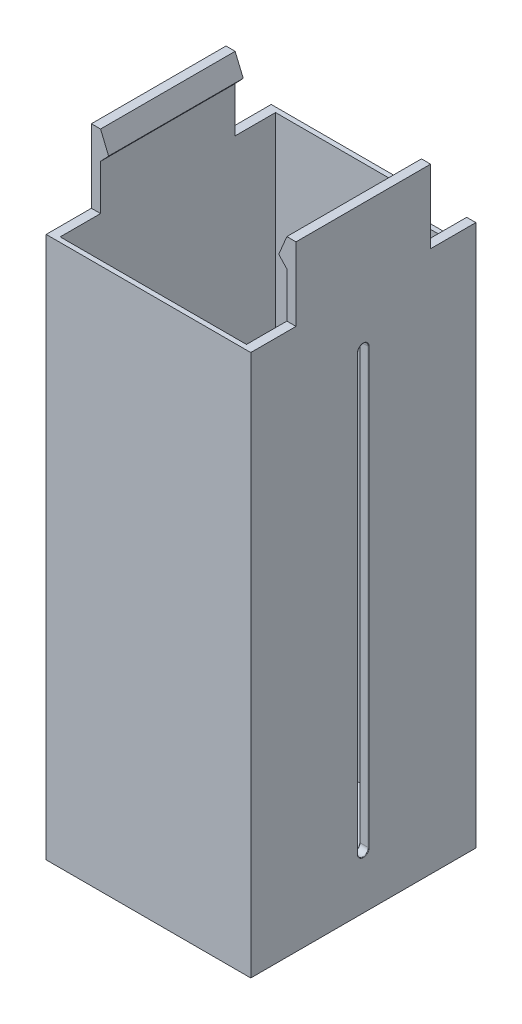
ISO-10303-21;
HEADER;
FILE_DESCRIPTION(('STEP AP214'),'2;1');
FILE_NAME('part.step','',(''),(''),'','','');
FILE_SCHEMA(('AUTOMOTIVE_DESIGN { 1 0 10303 214 1 1 1 1 }'));
ENDSEC;
DATA;
#1=APPLICATION_CONTEXT('core data for automotive mechanical design processes');
#2=APPLICATION_PROTOCOL_DEFINITION('international standard','automotive_design',2000,#1);
#3=PRODUCT_CONTEXT('',#1,'mechanical');
#4=PRODUCT('Part','Part','',(#3));
#5=PRODUCT_RELATED_PRODUCT_CATEGORY('part','',(#4));
#6=PRODUCT_DEFINITION_FORMATION('','',#4);
#7=PRODUCT_DEFINITION_CONTEXT('part definition',#1,'design');
#8=PRODUCT_DEFINITION('design','',#6,#7);
#9=PRODUCT_DEFINITION_SHAPE('','',#8);
#10=(LENGTH_UNIT() NAMED_UNIT(*) SI_UNIT(.MILLI.,.METRE.));
#11=(NAMED_UNIT(*) PLANE_ANGLE_UNIT() SI_UNIT($,.RADIAN.));
#12=(NAMED_UNIT(*) SI_UNIT($,.STERADIAN.) SOLID_ANGLE_UNIT());
#13=UNCERTAINTY_MEASURE_WITH_UNIT(LENGTH_MEASURE(1.E-05),#10,'distance_accuracy_value','');
#14=(GEOMETRIC_REPRESENTATION_CONTEXT(3) GLOBAL_UNCERTAINTY_ASSIGNED_CONTEXT((#13)) GLOBAL_UNIT_ASSIGNED_CONTEXT((#10,
#11,#12)) REPRESENTATION_CONTEXT('',''));
#15=CARTESIAN_POINT('',(0.,0.,0.));
#16=DIRECTION('',(0.,0.,1.));
#17=DIRECTION('',(1.,0.,0.));
#18=AXIS2_PLACEMENT_3D('',#15,#16,#17);
#19=CARTESIAN_POINT('',(0.,100.,0.));
#20=DIRECTION('',(0.,1.,0.));
#21=DIRECTION('',(0.,0.,1.));
#22=AXIS2_PLACEMENT_3D('',#19,#20,#21);
#23=PLANE('',#22);
#24=DIRECTION('',(-1.,0.,0.));
#25=VECTOR('',#24,1.);
#26=CARTESIAN_POINT('',(-19.,100.,-20.9));
#27=LINE('',#26,#25);
#28=CARTESIAN_POINT('',(19.,100.,-20.9));
#29=VERTEX_POINT('',#28);
#30=CARTESIAN_POINT('',(17.3,100.,-20.9));
#31=VERTEX_POINT('',#30);
#32=EDGE_CURVE('E403',#29,#31,#27,.T.);
#33=ORIENTED_EDGE('',*,*,#32,.T.);
#34=DIRECTION('',(0.,0.,-1.));
#35=VECTOR('',#34,1.);
#36=CARTESIAN_POINT('',(17.3,100.,-20.));
#37=LINE('',#36,#35);
#38=CARTESIAN_POINT('',(17.3,100.,-12.5));
#39=VERTEX_POINT('',#38);
#40=EDGE_CURVE('E258',#39,#31,#37,.T.);
#41=ORIENTED_EDGE('',*,*,#40,.F.);
#42=DIRECTION('',(-1.,0.,0.));
#43=VECTOR('',#42,1.);
#44=CARTESIAN_POINT('',(17.3,100.,-12.5));
#45=LINE('',#44,#43);
#46=CARTESIAN_POINT('',(19.,100.,-12.5));
#47=VERTEX_POINT('',#46);
#48=EDGE_CURVE('E320',#47,#39,#45,.T.);
#49=ORIENTED_EDGE('',*,*,#48,.F.);
#50=DIRECTION('',(0.,0.,-1.));
#51=VECTOR('',#50,1.);
#52=CARTESIAN_POINT('',(19.,100.,-20.9));
#53=LINE('',#52,#51);
#54=EDGE_CURVE('E398',#47,#29,#53,.T.);
#55=ORIENTED_EDGE('',*,*,#54,.T.);
#56=EDGE_LOOP('',(#33,#41,#49,#55));
#57=FACE_BOUND('',#56,.T.);
#58=ADVANCED_FACE('F35',(#57),#23,.T.);
#59=CARTESIAN_POINT('',(19.,100.,20.9));
#60=VERTEX_POINT('',#59);
#61=CARTESIAN_POINT('',(19.,100.,12.5));
#62=VERTEX_POINT('',#61);
#63=EDGE_CURVE('E399',#60,#62,#53,.T.);
#64=ORIENTED_EDGE('',*,*,#63,.T.);
#65=DIRECTION('',(1.,0.,0.));
#66=VECTOR('',#65,1.);
#67=CARTESIAN_POINT('',(17.3,100.,12.5));
#68=LINE('',#67,#66);
#69=CARTESIAN_POINT('',(17.3,100.,12.5));
#70=VERTEX_POINT('',#69);
#71=EDGE_CURVE('E306',#70,#62,#68,.T.);
#72=ORIENTED_EDGE('',*,*,#71,.F.);
#73=CARTESIAN_POINT('',(17.3,100.,20.));
#74=VERTEX_POINT('',#73);
#75=EDGE_CURVE('E373',#74,#70,#37,.T.);
#76=ORIENTED_EDGE('',*,*,#75,.F.);
#77=DIRECTION('',(1.,0.,0.));
#78=VECTOR('',#77,1.);
#79=CARTESIAN_POINT('',(17.3,100.,20.));
#80=LINE('',#79,#78);
#81=CARTESIAN_POINT('',(-17.3,100.,20.));
#82=VERTEX_POINT('',#81);
#83=EDGE_CURVE('E370',#82,#74,#80,.T.);
#84=ORIENTED_EDGE('',*,*,#83,.F.);
#85=DIRECTION('',(0.,0.,1.));
#86=VECTOR('',#85,1.);
#87=CARTESIAN_POINT('',(-17.3,100.,-20.));
#88=LINE('',#87,#86);
#89=CARTESIAN_POINT('',(-17.3,100.,12.5));
#90=VERTEX_POINT('',#89);
#91=EDGE_CURVE('E371',#90,#82,#88,.T.);
#92=ORIENTED_EDGE('',*,*,#91,.F.);
#93=DIRECTION('',(1.,0.,0.));
#94=VECTOR('',#93,1.);
#95=CARTESIAN_POINT('',(-17.3,100.,12.5));
#96=LINE('',#95,#94);
#97=CARTESIAN_POINT('',(-19.,100.,12.5));
#98=VERTEX_POINT('',#97);
#99=EDGE_CURVE('E339',#98,#90,#96,.T.);
#100=ORIENTED_EDGE('',*,*,#99,.F.);
#101=DIRECTION('',(0.,0.,1.));
#102=VECTOR('',#101,1.);
#103=CARTESIAN_POINT('',(-19.,100.,-20.9));
#104=LINE('',#103,#102);
#105=CARTESIAN_POINT('',(-19.,100.,20.9));
#106=VERTEX_POINT('',#105);
#107=EDGE_CURVE('E405',#98,#106,#104,.T.);
#108=ORIENTED_EDGE('',*,*,#107,.T.);
#109=DIRECTION('',(1.,0.,0.));
#110=VECTOR('',#109,1.);
#111=CARTESIAN_POINT('',(-19.,100.,20.9));
#112=LINE('',#111,#110);
#113=EDGE_CURVE('E408',#106,#60,#112,.T.);
#114=ORIENTED_EDGE('',*,*,#113,.T.);
#115=EDGE_LOOP('',(#64,#72,#76,#84,#92,#100,#108,#114));
#116=FACE_BOUND('',#115,.T.);
#117=ADVANCED_FACE('F543',(#116),#23,.T.);
#118=DIRECTION('',(0.,0.,-1.));
#119=VECTOR('',#118,1.);
#120=CARTESIAN_POINT('',(3.99999999999999,100.,-10.9));
#121=LINE('',#120,#119);
#122=CARTESIAN_POINT('',(3.99999999999999,100.,-20.));
#123=VERTEX_POINT('',#122);
#124=CARTESIAN_POINT('',(3.99999999999999,100.,-20.9));
#125=VERTEX_POINT('',#124);
#126=EDGE_CURVE('E270',#123,#125,#121,.T.);
#127=ORIENTED_EDGE('',*,*,#126,.T.);
#128=CARTESIAN_POINT('',(-19.,100.,-20.9));
#129=VERTEX_POINT('',#128);
#130=EDGE_CURVE('E402',#125,#129,#27,.T.);
#131=ORIENTED_EDGE('',*,*,#130,.T.);
#132=CARTESIAN_POINT('',(-19.,100.,-12.5));
#133=VERTEX_POINT('',#132);
#134=EDGE_CURVE('E406',#129,#133,#104,.T.);
#135=ORIENTED_EDGE('',*,*,#134,.T.);
#136=DIRECTION('',(-1.,0.,0.));
#137=VECTOR('',#136,1.);
#138=CARTESIAN_POINT('',(-17.3,100.,-12.5));
#139=LINE('',#138,#137);
#140=CARTESIAN_POINT('',(-17.3,100.,-12.5));
#141=VERTEX_POINT('',#140);
#142=EDGE_CURVE('E344',#141,#133,#139,.T.);
#143=ORIENTED_EDGE('',*,*,#142,.F.);
#144=CARTESIAN_POINT('',(-17.3,100.,-20.));
#145=VERTEX_POINT('',#144);
#146=EDGE_CURVE('E367',#145,#141,#88,.T.);
#147=ORIENTED_EDGE('',*,*,#146,.F.);
#148=DIRECTION('',(-1.,0.,0.));
#149=VECTOR('',#148,1.);
#150=CARTESIAN_POINT('',(17.3,100.,-20.));
#151=LINE('',#150,#149);
#152=EDGE_CURVE('E376',#123,#145,#151,.T.);
#153=ORIENTED_EDGE('',*,*,#152,.F.);
#154=EDGE_LOOP('',(#127,#131,#135,#143,#147,#153));
#155=FACE_BOUND('',#154,.T.);
#156=ADVANCED_FACE('F546',(#155),#23,.T.);
#157=CARTESIAN_POINT('',(19.,100.,-20.9));
#158=DIRECTION('',(-1.,0.,0.));
#159=DIRECTION('',(0.,0.,1.));
#160=AXIS2_PLACEMENT_3D('',#157,#158,#159);
#161=PLANE('',#160);
#162=DIRECTION('',(0.,-1.,0.));
#163=VECTOR('',#162,1.);
#164=CARTESIAN_POINT('',(19.,100.,1.1));
#165=LINE('',#164,#163);
#166=CARTESIAN_POINT('',(19.,9.4,1.1));
#167=VERTEX_POINT('',#166);
#168=CARTESIAN_POINT('',(19.,90.,1.1));
#169=VERTEX_POINT('',#168);
#170=EDGE_CURVE('E445',#167,#169,#165,.F.);
#171=ORIENTED_EDGE('',*,*,#170,.T.);
#172=CARTESIAN_POINT('',(19.,90.,0.));
#173=DIRECTION('',(-1.,0.,0.));
#174=DIRECTION('',(0.,0.,1.));
#175=AXIS2_PLACEMENT_3D('',#172,#173,#174);
#176=CIRCLE('',#175,1.1);
#177=CARTESIAN_POINT('',(19.,90.,-1.1));
#178=VERTEX_POINT('',#177);
#179=EDGE_CURVE('E450',#169,#178,#176,.T.);
#180=ORIENTED_EDGE('',*,*,#179,.T.);
#181=DIRECTION('',(0.,1.,0.));
#182=VECTOR('',#181,1.);
#183=CARTESIAN_POINT('',(19.,100.,-1.1));
#184=LINE('',#183,#182);
#185=CARTESIAN_POINT('',(19.,9.4,-1.1));
#186=VERTEX_POINT('',#185);
#187=EDGE_CURVE('E59',#178,#186,#184,.F.);
#188=ORIENTED_EDGE('',*,*,#187,.T.);
#189=CARTESIAN_POINT('',(19.,9.4,0.));
#190=DIRECTION('',(-1.,0.,0.));
#191=DIRECTION('',(0.,0.,1.));
#192=AXIS2_PLACEMENT_3D('',#189,#190,#191);
#193=CIRCLE('',#192,1.1);
#194=EDGE_CURVE('E447',#186,#167,#193,.T.);
#195=ORIENTED_EDGE('',*,*,#194,.T.);
#196=EDGE_LOOP('',(#171,#180,#188,#195));
#197=FACE_BOUND('',#196,.T.);
#198=DIRECTION('',(0.,-1.,0.));
#199=VECTOR('',#198,1.);
#200=CARTESIAN_POINT('',(19.,100.,20.9));
#201=LINE('',#200,#199);
#202=CARTESIAN_POINT('',(19.,-0.6,20.9));
#203=VERTEX_POINT('',#202);
#204=EDGE_CURVE('E410',#60,#203,#201,.T.);
#205=ORIENTED_EDGE('',*,*,#204,.T.);
#206=DIRECTION('',(0.,0.,1.));
#207=VECTOR('',#206,1.);
#208=CARTESIAN_POINT('',(19.,-0.6,20.9));
#209=LINE('',#208,#207);
#210=CARTESIAN_POINT('',(19.,-0.6,-20.9));
#211=VERTEX_POINT('',#210);
#212=EDGE_CURVE('E273',#211,#203,#209,.T.);
#213=ORIENTED_EDGE('',*,*,#212,.F.);
#214=DIRECTION('',(0.,-1.,0.));
#215=VECTOR('',#214,1.);
#216=CARTESIAN_POINT('',(19.,100.,-20.9));
#217=LINE('',#216,#215);
#218=EDGE_CURVE('E416',#29,#211,#217,.T.);
#219=ORIENTED_EDGE('',*,*,#218,.F.);
#220=ORIENTED_EDGE('',*,*,#54,.F.);
#221=DIRECTION('',(0.,-1.,0.));
#222=VECTOR('',#221,1.);
#223=CARTESIAN_POINT('',(19.,113.6,-12.5));
#224=LINE('',#223,#222);
#225=CARTESIAN_POINT('',(19.,113.6,-12.5));
#226=VERTEX_POINT('',#225);
#227=EDGE_CURVE('E332',#226,#47,#224,.T.);
#228=ORIENTED_EDGE('',*,*,#227,.F.);
#229=DIRECTION('',(0.,0.,-1.));
#230=VECTOR('',#229,1.);
#231=CARTESIAN_POINT('',(19.,113.6,12.5));
#232=LINE('',#231,#230);
#233=CARTESIAN_POINT('',(19.,113.6,12.5));
#234=VERTEX_POINT('',#233);
#235=EDGE_CURVE('E322',#234,#226,#232,.T.);
#236=ORIENTED_EDGE('',*,*,#235,.F.);
#237=DIRECTION('',(0.,-1.,0.));
#238=VECTOR('',#237,1.);
#239=CARTESIAN_POINT('',(19.,113.6,12.5));
#240=LINE('',#239,#238);
#241=EDGE_CURVE('E334',#234,#62,#240,.T.);
#242=ORIENTED_EDGE('',*,*,#241,.T.);
#243=ORIENTED_EDGE('',*,*,#63,.F.);
#244=EDGE_LOOP('',(#205,#213,#219,#220,#228,#236,#242,#243));
#245=FACE_BOUND('',#244,.T.);
#246=ADVANCED_FACE('F479',(#197,#245),#161,.F.);
#247=CARTESIAN_POINT('',(-19.,100.,-20.9));
#248=DIRECTION('',(0.,0.,1.));
#249=DIRECTION('',(1.,0.,0.));
#250=AXIS2_PLACEMENT_3D('',#247,#248,#249);
#251=PLANE('',#250);
#252=DIRECTION('',(-1.,0.,0.));
#253=VECTOR('',#252,1.);
#254=CARTESIAN_POINT('',(17.3,95.6,-20.9));
#255=LINE('',#254,#253);
#256=CARTESIAN_POINT('',(17.3,95.6,-20.9));
#257=VERTEX_POINT('',#256);
#258=CARTESIAN_POINT('',(3.99999999999998,95.6,-20.9));
#259=VERTEX_POINT('',#258);
#260=EDGE_CURVE('E245',#257,#259,#255,.T.);
#261=ORIENTED_EDGE('',*,*,#260,.F.);
#262=DIRECTION('',(0.,-1.,0.));
#263=VECTOR('',#262,1.);
#264=CARTESIAN_POINT('',(17.3,100.,-20.9));
#265=LINE('',#264,#263);
#266=EDGE_CURVE('E255',#31,#257,#265,.T.);
#267=ORIENTED_EDGE('',*,*,#266,.F.);
#268=ORIENTED_EDGE('',*,*,#32,.F.);
#269=ORIENTED_EDGE('',*,*,#218,.T.);
#270=DIRECTION('',(1.,0.,0.));
#271=VECTOR('',#270,1.);
#272=CARTESIAN_POINT('',(19.,-0.6,-20.9));
#273=LINE('',#272,#271);
#274=CARTESIAN_POINT('',(-19.,-0.6,-20.9));
#275=VERTEX_POINT('',#274);
#276=EDGE_CURVE('E283',#275,#211,#273,.T.);
#277=ORIENTED_EDGE('',*,*,#276,.F.);
#278=DIRECTION('',(0.,-1.,0.));
#279=VECTOR('',#278,1.);
#280=CARTESIAN_POINT('',(-19.,100.,-20.9));
#281=LINE('',#280,#279);
#282=EDGE_CURVE('E414',#129,#275,#281,.T.);
#283=ORIENTED_EDGE('',*,*,#282,.F.);
#284=ORIENTED_EDGE('',*,*,#130,.F.);
#285=DIRECTION('',(0.,1.,0.));
#286=VECTOR('',#285,1.);
#287=CARTESIAN_POINT('',(3.99999999999999,100.,-20.9));
#288=LINE('',#287,#286);
#289=EDGE_CURVE('E252',#259,#125,#288,.T.);
#290=ORIENTED_EDGE('',*,*,#289,.F.);
#291=EDGE_LOOP('',(#261,#267,#268,#269,#277,#283,#284,#290));
#292=FACE_BOUND('',#291,.T.);
#293=ADVANCED_FACE('F264',(#292),#251,.F.);
#294=CARTESIAN_POINT('',(-19.,100.,-20.9));
#295=DIRECTION('',(1.,0.,0.));
#296=DIRECTION('',(0.,0.,-1.));
#297=AXIS2_PLACEMENT_3D('',#294,#295,#296);
#298=PLANE('',#297);
#299=ORIENTED_EDGE('',*,*,#282,.T.);
#300=DIRECTION('',(0.,0.,-1.));
#301=VECTOR('',#300,1.);
#302=CARTESIAN_POINT('',(-19.,-0.6,20.9));
#303=LINE('',#302,#301);
#304=CARTESIAN_POINT('',(-19.,-0.6,20.9));
#305=VERTEX_POINT('',#304);
#306=EDGE_CURVE('E280',#305,#275,#303,.T.);
#307=ORIENTED_EDGE('',*,*,#306,.F.);
#308=DIRECTION('',(0.,-1.,0.));
#309=VECTOR('',#308,1.);
#310=CARTESIAN_POINT('',(-19.,100.,20.9));
#311=LINE('',#310,#309);
#312=EDGE_CURVE('E412',#106,#305,#311,.T.);
#313=ORIENTED_EDGE('',*,*,#312,.F.);
#314=ORIENTED_EDGE('',*,*,#107,.F.);
#315=DIRECTION('',(0.,-1.,0.));
#316=VECTOR('',#315,1.);
#317=CARTESIAN_POINT('',(-19.,113.6,12.5));
#318=LINE('',#317,#316);
#319=CARTESIAN_POINT('',(-19.,113.6,12.5));
#320=VERTEX_POINT('',#319);
#321=EDGE_CURVE('E363',#320,#98,#318,.T.);
#322=ORIENTED_EDGE('',*,*,#321,.F.);
#323=DIRECTION('',(0.,0.,1.));
#324=VECTOR('',#323,1.);
#325=CARTESIAN_POINT('',(-19.,113.6,12.5));
#326=LINE('',#325,#324);
#327=CARTESIAN_POINT('',(-19.,113.6,-12.5));
#328=VERTEX_POINT('',#327);
#329=EDGE_CURVE('E340',#328,#320,#326,.T.);
#330=ORIENTED_EDGE('',*,*,#329,.F.);
#331=DIRECTION('',(0.,-1.,0.));
#332=VECTOR('',#331,1.);
#333=CARTESIAN_POINT('',(-19.,113.6,-12.5));
#334=LINE('',#333,#332);
#335=EDGE_CURVE('E352',#328,#133,#334,.T.);
#336=ORIENTED_EDGE('',*,*,#335,.T.);
#337=ORIENTED_EDGE('',*,*,#134,.F.);
#338=EDGE_LOOP('',(#299,#307,#313,#314,#322,#330,#336,#337));
#339=FACE_BOUND('',#338,.T.);
#340=ADVANCED_FACE('F568',(#339),#298,.F.);
#341=CARTESIAN_POINT('',(-19.,100.,20.9));
#342=DIRECTION('',(0.,0.,-1.));
#343=DIRECTION('',(-1.,0.,0.));
#344=AXIS2_PLACEMENT_3D('',#341,#342,#343);
#345=PLANE('',#344);
#346=ORIENTED_EDGE('',*,*,#312,.T.);
#347=DIRECTION('',(-1.,0.,0.));
#348=VECTOR('',#347,1.);
#349=CARTESIAN_POINT('',(19.,-0.6,20.9));
#350=LINE('',#349,#348);
#351=EDGE_CURVE('E277',#203,#305,#350,.T.);
#352=ORIENTED_EDGE('',*,*,#351,.F.);
#353=ORIENTED_EDGE('',*,*,#204,.F.);
#354=ORIENTED_EDGE('',*,*,#113,.F.);
#355=EDGE_LOOP('',(#346,#352,#353,#354));
#356=FACE_BOUND('',#355,.T.);
#357=ADVANCED_FACE('F648',(#356),#345,.F.);
#358=CARTESIAN_POINT('',(-17.3,100.,-20.));
#359=DIRECTION('',(1.,0.,0.));
#360=DIRECTION('',(0.,0.,-1.));
#361=AXIS2_PLACEMENT_3D('',#358,#359,#360);
#362=PLANE('',#361);
#363=DIRECTION('',(0.,0.,1.));
#364=VECTOR('',#363,1.);
#365=CARTESIAN_POINT('',(-17.3,108.4,-17.9120236510939));
#366=LINE('',#365,#364);
#367=CARTESIAN_POINT('',(-17.3,108.4,-12.5));
#368=VERTEX_POINT('',#367);
#369=CARTESIAN_POINT('',(-17.3,108.4,12.5));
#370=VERTEX_POINT('',#369);
#371=EDGE_CURVE('E312',#368,#370,#366,.T.);
#372=ORIENTED_EDGE('',*,*,#371,.T.);
#373=DIRECTION('',(0.,-1.,0.));
#374=VECTOR('',#373,1.);
#375=CARTESIAN_POINT('',(-17.3,113.6,12.5));
#376=LINE('',#375,#374);
#377=EDGE_CURVE('E361',#370,#90,#376,.T.);
#378=ORIENTED_EDGE('',*,*,#377,.T.);
#379=ORIENTED_EDGE('',*,*,#91,.T.);
#380=DIRECTION('',(0.,-1.,0.));
#381=VECTOR('',#380,1.);
#382=CARTESIAN_POINT('',(-17.3,100.,20.));
#383=LINE('',#382,#381);
#384=CARTESIAN_POINT('',(-17.3,0.,20.));
#385=VERTEX_POINT('',#384);
#386=EDGE_CURVE('E395',#82,#385,#383,.T.);
#387=ORIENTED_EDGE('',*,*,#386,.T.);
#388=DIRECTION('',(0.,0.,1.));
#389=VECTOR('',#388,1.);
#390=CARTESIAN_POINT('',(-17.3,0.,-20.));
#391=LINE('',#390,#389);
#392=CARTESIAN_POINT('',(-17.3,0.,-20.));
#393=VERTEX_POINT('',#392);
#394=EDGE_CURVE('E366',#393,#385,#391,.T.);
#395=ORIENTED_EDGE('',*,*,#394,.F.);
#396=DIRECTION('',(0.,-1.,0.));
#397=VECTOR('',#396,1.);
#398=CARTESIAN_POINT('',(-17.3,100.,-20.));
#399=LINE('',#398,#397);
#400=EDGE_CURVE('E378',#145,#393,#399,.T.);
#401=ORIENTED_EDGE('',*,*,#400,.F.);
#402=ORIENTED_EDGE('',*,*,#146,.T.);
#403=DIRECTION('',(0.,-1.,0.));
#404=VECTOR('',#403,1.);
#405=CARTESIAN_POINT('',(-17.3,113.6,-12.5));
#406=LINE('',#405,#404);
#407=EDGE_CURVE('E359',#368,#141,#406,.T.);
#408=ORIENTED_EDGE('',*,*,#407,.F.);
#409=EDGE_LOOP('',(#372,#378,#379,#387,#395,#401,#402,#408));
#410=FACE_BOUND('',#409,.T.);
#411=ADVANCED_FACE('F539',(#410),#362,.T.);
#412=CARTESIAN_POINT('',(17.3,100.,20.));
#413=DIRECTION('',(0.,0.,-1.));
#414=DIRECTION('',(-1.,0.,0.));
#415=AXIS2_PLACEMENT_3D('',#412,#413,#414);
#416=PLANE('',#415);
#417=DIRECTION('',(1.,0.,0.));
#418=VECTOR('',#417,1.);
#419=CARTESIAN_POINT('',(17.3,0.,20.));
#420=LINE('',#419,#418);
#421=CARTESIAN_POINT('',(17.3,0.,20.));
#422=VERTEX_POINT('',#421);
#423=EDGE_CURVE('E381',#385,#422,#420,.T.);
#424=ORIENTED_EDGE('',*,*,#423,.F.);
#425=ORIENTED_EDGE('',*,*,#386,.F.);
#426=ORIENTED_EDGE('',*,*,#83,.T.);
#427=DIRECTION('',(0.,-1.,0.));
#428=VECTOR('',#427,1.);
#429=CARTESIAN_POINT('',(17.3,100.,20.));
#430=LINE('',#429,#428);
#431=EDGE_CURVE('E393',#74,#422,#430,.T.);
#432=ORIENTED_EDGE('',*,*,#431,.T.);
#433=EDGE_LOOP('',(#424,#425,#426,#432));
#434=FACE_BOUND('',#433,.T.);
#435=ADVANCED_FACE('F528',(#434),#416,.T.);
#436=CARTESIAN_POINT('',(17.3,100.,-20.));
#437=DIRECTION('',(-1.,0.,0.));
#438=DIRECTION('',(0.,0.,1.));
#439=AXIS2_PLACEMENT_3D('',#436,#437,#438);
#440=PLANE('',#439);
#441=DIRECTION('',(0.,1.,0.));
#442=VECTOR('',#441,1.);
#443=CARTESIAN_POINT('',(17.3,9.4,1.1));
#444=LINE('',#443,#442);
#445=CARTESIAN_POINT('',(17.3,90.,1.1));
#446=VERTEX_POINT('',#445);
#447=CARTESIAN_POINT('',(17.3,9.4,1.1));
#448=VERTEX_POINT('',#447);
#449=EDGE_CURVE('E427',#446,#448,#444,.F.);
#450=ORIENTED_EDGE('',*,*,#449,.T.);
#451=CARTESIAN_POINT('',(17.3,9.4,0.));
#452=DIRECTION('',(-1.,0.,0.));
#453=DIRECTION('',(0.,0.,1.));
#454=AXIS2_PLACEMENT_3D('',#451,#452,#453);
#455=CIRCLE('',#454,1.1);
#456=CARTESIAN_POINT('',(17.3,9.4,-1.1));
#457=VERTEX_POINT('',#456);
#458=EDGE_CURVE('E433',#448,#457,#455,.F.);
#459=ORIENTED_EDGE('',*,*,#458,.T.);
#460=DIRECTION('',(0.,-1.,0.));
#461=VECTOR('',#460,1.);
#462=CARTESIAN_POINT('',(17.3,90.,-1.1));
#463=LINE('',#462,#461);
#464=CARTESIAN_POINT('',(17.3,90.,-1.1));
#465=VERTEX_POINT('',#464);
#466=EDGE_CURVE('E431',#457,#465,#463,.F.);
#467=ORIENTED_EDGE('',*,*,#466,.T.);
#468=CARTESIAN_POINT('',(17.3,90.,0.));
#469=DIRECTION('',(-1.,0.,0.));
#470=DIRECTION('',(0.,0.,1.));
#471=AXIS2_PLACEMENT_3D('',#468,#469,#470);
#472=CIRCLE('',#471,1.1);
#473=EDGE_CURVE('E429',#465,#446,#472,.F.);
#474=ORIENTED_EDGE('',*,*,#473,.T.);
#475=EDGE_LOOP('',(#450,#459,#467,#474));
#476=FACE_BOUND('',#475,.T.);
#477=DIRECTION('',(0.,-1.,0.));
#478=VECTOR('',#477,1.);
#479=CARTESIAN_POINT('',(17.3,113.6,-12.5));
#480=LINE('',#479,#478);
#481=CARTESIAN_POINT('',(17.3,108.4,-12.5));
#482=VERTEX_POINT('',#481);
#483=EDGE_CURVE('E327',#482,#39,#480,.T.);
#484=ORIENTED_EDGE('',*,*,#483,.T.);
#485=ORIENTED_EDGE('',*,*,#40,.T.);
#486=ORIENTED_EDGE('',*,*,#266,.T.);
#487=DIRECTION('',(0.,0.,-1.));
#488=VECTOR('',#487,1.);
#489=CARTESIAN_POINT('',(17.3,95.6,-10.9));
#490=LINE('',#489,#488);
#491=CARTESIAN_POINT('',(17.3,95.6,-20.));
#492=VERTEX_POINT('',#491);
#493=EDGE_CURVE('E241',#492,#257,#490,.T.);
#494=ORIENTED_EDGE('',*,*,#493,.F.);
#495=DIRECTION('',(0.,-1.,0.));
#496=VECTOR('',#495,1.);
#497=CARTESIAN_POINT('',(17.3,100.,-20.));
#498=LINE('',#497,#496);
#499=CARTESIAN_POINT('',(17.3,0.,-20.));
#500=VERTEX_POINT('',#499);
#501=EDGE_CURVE('E391',#492,#500,#498,.T.);
#502=ORIENTED_EDGE('',*,*,#501,.T.);
#503=DIRECTION('',(0.,0.,-1.));
#504=VECTOR('',#503,1.);
#505=CARTESIAN_POINT('',(17.3,0.,-20.));
#506=LINE('',#505,#504);
#507=EDGE_CURVE('E384',#422,#500,#506,.T.);
#508=ORIENTED_EDGE('',*,*,#507,.F.);
#509=ORIENTED_EDGE('',*,*,#431,.F.);
#510=ORIENTED_EDGE('',*,*,#75,.T.);
#511=DIRECTION('',(0.,-1.,0.));
#512=VECTOR('',#511,1.);
#513=CARTESIAN_POINT('',(17.3,113.6,12.5));
#514=LINE('',#513,#512);
#515=CARTESIAN_POINT('',(17.3,108.4,12.5));
#516=VERTEX_POINT('',#515);
#517=EDGE_CURVE('E337',#516,#70,#514,.T.);
#518=ORIENTED_EDGE('',*,*,#517,.F.);
#519=DIRECTION('',(0.,0.,1.));
#520=VECTOR('',#519,1.);
#521=CARTESIAN_POINT('',(17.3,108.4,-17.9120236510939));
#522=LINE('',#521,#520);
#523=EDGE_CURVE('E290',#482,#516,#522,.T.);
#524=ORIENTED_EDGE('',*,*,#523,.F.);
#525=EDGE_LOOP('',(#484,#485,#486,#494,#502,#508,#509,#510,#518,#524));
#526=FACE_BOUND('',#525,.T.);
#527=ADVANCED_FACE('F256',(#476,#526),#440,.T.);
#528=CARTESIAN_POINT('',(17.3,100.,-20.));
#529=DIRECTION('',(0.,0.,1.));
#530=DIRECTION('',(1.,0.,0.));
#531=AXIS2_PLACEMENT_3D('',#528,#529,#530);
#532=PLANE('',#531);
#533=DIRECTION('',(0.,-1.,0.));
#534=VECTOR('',#533,1.);
#535=CARTESIAN_POINT('',(3.99999999999999,100.,-20.));
#536=LINE('',#535,#534);
#537=CARTESIAN_POINT('',(3.99999999999998,95.6,-20.));
#538=VERTEX_POINT('',#537);
#539=EDGE_CURVE('E419',#123,#538,#536,.T.);
#540=ORIENTED_EDGE('',*,*,#539,.F.);
#541=ORIENTED_EDGE('',*,*,#152,.T.);
#542=ORIENTED_EDGE('',*,*,#400,.T.);
#543=DIRECTION('',(-1.,0.,0.));
#544=VECTOR('',#543,1.);
#545=CARTESIAN_POINT('',(17.3,0.,-20.));
#546=LINE('',#545,#544);
#547=EDGE_CURVE('E387',#500,#393,#546,.T.);
#548=ORIENTED_EDGE('',*,*,#547,.F.);
#549=ORIENTED_EDGE('',*,*,#501,.F.);
#550=DIRECTION('',(1.,0.,0.));
#551=VECTOR('',#550,1.);
#552=CARTESIAN_POINT('',(17.3,95.6,-20.));
#553=LINE('',#552,#551);
#554=EDGE_CURVE('E248',#538,#492,#553,.T.);
#555=ORIENTED_EDGE('',*,*,#554,.F.);
#556=EDGE_LOOP('',(#540,#541,#542,#548,#549,#555));
#557=FACE_BOUND('',#556,.T.);
#558=ADVANCED_FACE('F527',(#557),#532,.T.);
#559=CARTESIAN_POINT('',(-17.3,113.6,12.5));
#560=DIRECTION('',(0.,0.,-1.));
#561=DIRECTION('',(-1.,0.,0.));
#562=AXIS2_PLACEMENT_3D('',#559,#560,#561);
#563=PLANE('',#562);
#564=ORIENTED_EDGE('',*,*,#99,.T.);
#565=ORIENTED_EDGE('',*,*,#377,.F.);
#566=DIRECTION('',(0.683941128881329,0.729537204140086,0.));
#567=VECTOR('',#566,1.);
#568=CARTESIAN_POINT('',(-15.8,110.,12.5));
#569=LINE('',#568,#567);
#570=CARTESIAN_POINT('',(-15.8,110.,12.5));
#571=VERTEX_POINT('',#570);
#572=EDGE_CURVE('E309',#370,#571,#569,.T.);
#573=ORIENTED_EDGE('',*,*,#572,.T.);
#574=DIRECTION('',(-0.384615384615384,0.923076923076923,0.));
#575=VECTOR('',#574,1.);
#576=CARTESIAN_POINT('',(-17.3,113.6,12.5));
#577=LINE('',#576,#575);
#578=CARTESIAN_POINT('',(-17.3,113.6,12.5));
#579=VERTEX_POINT('',#578);
#580=EDGE_CURVE('E300',#571,#579,#577,.T.);
#581=ORIENTED_EDGE('',*,*,#580,.T.);
#582=DIRECTION('',(1.,0.,0.));
#583=VECTOR('',#582,1.);
#584=CARTESIAN_POINT('',(-17.3,113.6,12.5));
#585=LINE('',#584,#583);
#586=EDGE_CURVE('E343',#320,#579,#585,.T.);
#587=ORIENTED_EDGE('',*,*,#586,.F.);
#588=ORIENTED_EDGE('',*,*,#321,.T.);
#589=EDGE_LOOP('',(#564,#565,#573,#581,#587,#588));
#590=FACE_BOUND('',#589,.T.);
#591=ADVANCED_FACE('F535',(#590),#563,.F.);
#592=CARTESIAN_POINT('',(-17.3,113.6,-12.5));
#593=DIRECTION('',(0.,0.,1.));
#594=DIRECTION('',(1.,0.,0.));
#595=AXIS2_PLACEMENT_3D('',#592,#593,#594);
#596=PLANE('',#595);
#597=ORIENTED_EDGE('',*,*,#142,.T.);
#598=ORIENTED_EDGE('',*,*,#335,.F.);
#599=DIRECTION('',(-1.,0.,0.));
#600=VECTOR('',#599,1.);
#601=CARTESIAN_POINT('',(-17.3,113.6,-12.5));
#602=LINE('',#601,#600);
#603=CARTESIAN_POINT('',(-17.3,113.6,-12.5));
#604=VERTEX_POINT('',#603);
#605=EDGE_CURVE('E350',#604,#328,#602,.T.);
#606=ORIENTED_EDGE('',*,*,#605,.F.);
#607=DIRECTION('',(0.384615384615384,-0.923076923076923,0.));
#608=VECTOR('',#607,1.);
#609=CARTESIAN_POINT('',(-17.3,113.6,-12.5));
#610=LINE('',#609,#608);
#611=CARTESIAN_POINT('',(-15.8,110.,-12.5));
#612=VERTEX_POINT('',#611);
#613=EDGE_CURVE('E303',#604,#612,#610,.T.);
#614=ORIENTED_EDGE('',*,*,#613,.T.);
#615=DIRECTION('',(-0.683941128881329,-0.729537204140086,0.));
#616=VECTOR('',#615,1.);
#617=CARTESIAN_POINT('',(-15.8,110.,-12.5));
#618=LINE('',#617,#616);
#619=EDGE_CURVE('E301',#612,#368,#618,.T.);
#620=ORIENTED_EDGE('',*,*,#619,.T.);
#621=ORIENTED_EDGE('',*,*,#407,.T.);
#622=EDGE_LOOP('',(#597,#598,#606,#614,#620,#621));
#623=FACE_BOUND('',#622,.T.);
#624=ADVANCED_FACE('F573',(#623),#596,.F.);
#625=CARTESIAN_POINT('',(0.,113.6,0.));
#626=DIRECTION('',(0.,1.,0.));
#627=DIRECTION('',(0.,0.,1.));
#628=AXIS2_PLACEMENT_3D('',#625,#626,#627);
#629=PLANE('',#628);
#630=ORIENTED_EDGE('',*,*,#329,.T.);
#631=ORIENTED_EDGE('',*,*,#586,.T.);
#632=DIRECTION('',(0.,0.,-1.));
#633=VECTOR('',#632,1.);
#634=CARTESIAN_POINT('',(-17.3,113.6,12.5));
#635=LINE('',#634,#633);
#636=EDGE_CURVE('E347',#579,#604,#635,.T.);
#637=ORIENTED_EDGE('',*,*,#636,.T.);
#638=ORIENTED_EDGE('',*,*,#605,.T.);
#639=EDGE_LOOP('',(#630,#631,#637,#638));
#640=FACE_BOUND('',#639,.T.);
#641=ADVANCED_FACE('F628',(#640),#629,.T.);
#642=CARTESIAN_POINT('',(17.3,113.6,12.5));
#643=DIRECTION('',(0.,0.,-1.));
#644=DIRECTION('',(-1.,0.,0.));
#645=AXIS2_PLACEMENT_3D('',#642,#643,#644);
#646=PLANE('',#645);
#647=ORIENTED_EDGE('',*,*,#71,.T.);
#648=ORIENTED_EDGE('',*,*,#241,.F.);
#649=DIRECTION('',(1.,0.,0.));
#650=VECTOR('',#649,1.);
#651=CARTESIAN_POINT('',(17.3,113.6,12.5));
#652=LINE('',#651,#650);
#653=CARTESIAN_POINT('',(17.3,113.6,12.5));
#654=VERTEX_POINT('',#653);
#655=EDGE_CURVE('E319',#654,#234,#652,.T.);
#656=ORIENTED_EDGE('',*,*,#655,.F.);
#657=DIRECTION('',(-0.384615384615385,-0.923076923076923,0.));
#658=VECTOR('',#657,1.);
#659=CARTESIAN_POINT('',(17.3,113.6,12.5));
#660=LINE('',#659,#658);
#661=CARTESIAN_POINT('',(15.8,110.,12.5));
#662=VERTEX_POINT('',#661);
#663=EDGE_CURVE('E286',#654,#662,#660,.T.);
#664=ORIENTED_EDGE('',*,*,#663,.T.);
#665=DIRECTION('',(0.683941128881329,-0.729537204140086,0.));
#666=VECTOR('',#665,1.);
#667=CARTESIAN_POINT('',(15.8,110.,12.5));
#668=LINE('',#667,#666);
#669=EDGE_CURVE('E293',#662,#516,#668,.T.);
#670=ORIENTED_EDGE('',*,*,#669,.T.);
#671=ORIENTED_EDGE('',*,*,#517,.T.);
#672=EDGE_LOOP('',(#647,#648,#656,#664,#670,#671));
#673=FACE_BOUND('',#672,.T.);
#674=ADVANCED_FACE('F624',(#673),#646,.F.);
#675=CARTESIAN_POINT('',(17.3,113.6,-12.5));
#676=DIRECTION('',(0.,0.,1.));
#677=DIRECTION('',(1.,0.,0.));
#678=AXIS2_PLACEMENT_3D('',#675,#676,#677);
#679=PLANE('',#678);
#680=ORIENTED_EDGE('',*,*,#48,.T.);
#681=ORIENTED_EDGE('',*,*,#483,.F.);
#682=DIRECTION('',(-0.683941128881329,0.729537204140086,0.));
#683=VECTOR('',#682,1.);
#684=CARTESIAN_POINT('',(15.8,110.,-12.5));
#685=LINE('',#684,#683);
#686=CARTESIAN_POINT('',(15.8,110.,-12.5));
#687=VERTEX_POINT('',#686);
#688=EDGE_CURVE('E289',#482,#687,#685,.T.);
#689=ORIENTED_EDGE('',*,*,#688,.T.);
#690=DIRECTION('',(0.384615384615385,0.923076923076923,0.));
#691=VECTOR('',#690,1.);
#692=CARTESIAN_POINT('',(17.3,113.6,-12.5));
#693=LINE('',#692,#691);
#694=CARTESIAN_POINT('',(17.3,113.6,-12.5));
#695=VERTEX_POINT('',#694);
#696=EDGE_CURVE('E287',#687,#695,#693,.T.);
#697=ORIENTED_EDGE('',*,*,#696,.T.);
#698=DIRECTION('',(-1.,0.,0.));
#699=VECTOR('',#698,1.);
#700=CARTESIAN_POINT('',(17.3,113.6,-12.5));
#701=LINE('',#700,#699);
#702=EDGE_CURVE('E324',#226,#695,#701,.T.);
#703=ORIENTED_EDGE('',*,*,#702,.F.);
#704=ORIENTED_EDGE('',*,*,#227,.T.);
#705=EDGE_LOOP('',(#680,#681,#689,#697,#703,#704));
#706=FACE_BOUND('',#705,.T.);
#707=ADVANCED_FACE('F620',(#706),#679,.F.);
#708=CARTESIAN_POINT('',(0.,113.6,0.));
#709=DIRECTION('',(0.,-1.,0.));
#710=DIRECTION('',(0.,0.,-1.));
#711=AXIS2_PLACEMENT_3D('',#708,#709,#710);
#712=PLANE('',#711);
#713=DIRECTION('',(0.,0.,1.));
#714=VECTOR('',#713,1.);
#715=CARTESIAN_POINT('',(17.3,113.6,12.5));
#716=LINE('',#715,#714);
#717=EDGE_CURVE('E316',#695,#654,#716,.T.);
#718=ORIENTED_EDGE('',*,*,#717,.T.);
#719=ORIENTED_EDGE('',*,*,#655,.T.);
#720=ORIENTED_EDGE('',*,*,#235,.T.);
#721=ORIENTED_EDGE('',*,*,#702,.T.);
#722=EDGE_LOOP('',(#718,#719,#720,#721));
#723=FACE_BOUND('',#722,.T.);
#724=ADVANCED_FACE('F616',(#723),#712,.F.);
#725=CARTESIAN_POINT('',(-17.3,113.6,-17.9120236510939));
#726=DIRECTION('',(0.923076923076923,0.384615384615384,0.));
#727=DIRECTION('',(-0.384615384615384,0.923076923076923,0.));
#728=AXIS2_PLACEMENT_3D('',#725,#726,#727);
#729=PLANE('',#728);
#730=ORIENTED_EDGE('',*,*,#613,.F.);
#731=ORIENTED_EDGE('',*,*,#636,.F.);
#732=ORIENTED_EDGE('',*,*,#580,.F.);
#733=DIRECTION('',(0.,0.,1.));
#734=VECTOR('',#733,1.);
#735=CARTESIAN_POINT('',(-15.8,110.,-17.9120236510939));
#736=LINE('',#735,#734);
#737=EDGE_CURVE('E304',#612,#571,#736,.T.);
#738=ORIENTED_EDGE('',*,*,#737,.F.);
#739=EDGE_LOOP('',(#730,#731,#732,#738));
#740=FACE_BOUND('',#739,.T.);
#741=ADVANCED_FACE('F612',(#740),#729,.T.);
#742=CARTESIAN_POINT('',(-15.8,110.,-17.9120236510939));
#743=DIRECTION('',(0.729537204140086,-0.683941128881329,0.));
#744=DIRECTION('',(0.683941128881329,0.729537204140086,0.));
#745=AXIS2_PLACEMENT_3D('',#742,#743,#744);
#746=PLANE('',#745);
#747=ORIENTED_EDGE('',*,*,#619,.F.);
#748=ORIENTED_EDGE('',*,*,#737,.T.);
#749=ORIENTED_EDGE('',*,*,#572,.F.);
#750=ORIENTED_EDGE('',*,*,#371,.F.);
#751=EDGE_LOOP('',(#747,#748,#749,#750));
#752=FACE_BOUND('',#751,.T.);
#753=ADVANCED_FACE('F608',(#752),#746,.T.);
#754=CARTESIAN_POINT('',(17.3,113.6,-17.9120236510939));
#755=DIRECTION('',(-0.923076923076923,0.384615384615385,0.));
#756=DIRECTION('',(-0.384615384615385,-0.923076923076923,0.));
#757=AXIS2_PLACEMENT_3D('',#754,#755,#756);
#758=PLANE('',#757);
#759=ORIENTED_EDGE('',*,*,#696,.F.);
#760=DIRECTION('',(0.,0.,1.));
#761=VECTOR('',#760,1.);
#762=CARTESIAN_POINT('',(15.8,110.,-17.9120236510939));
#763=LINE('',#762,#761);
#764=EDGE_CURVE('E296',#687,#662,#763,.T.);
#765=ORIENTED_EDGE('',*,*,#764,.T.);
#766=ORIENTED_EDGE('',*,*,#663,.F.);
#767=ORIENTED_EDGE('',*,*,#717,.F.);
#768=EDGE_LOOP('',(#759,#765,#766,#767));
#769=FACE_BOUND('',#768,.T.);
#770=ADVANCED_FACE('F604',(#769),#758,.T.);
#771=CARTESIAN_POINT('',(15.8,110.,-17.9120236510939));
#772=DIRECTION('',(-0.729537204140086,-0.683941128881329,0.));
#773=DIRECTION('',(0.683941128881329,-0.729537204140086,0.));
#774=AXIS2_PLACEMENT_3D('',#771,#772,#773);
#775=PLANE('',#774);
#776=ORIENTED_EDGE('',*,*,#688,.F.);
#777=ORIENTED_EDGE('',*,*,#523,.T.);
#778=ORIENTED_EDGE('',*,*,#669,.F.);
#779=ORIENTED_EDGE('',*,*,#764,.F.);
#780=EDGE_LOOP('',(#776,#777,#778,#779));
#781=FACE_BOUND('',#780,.T.);
#782=ADVANCED_FACE('F600',(#781),#775,.T.);
#783=CARTESIAN_POINT('',(0.,0.,0.));
#784=DIRECTION('',(0.,1.,0.));
#785=DIRECTION('',(0.,0.,1.));
#786=AXIS2_PLACEMENT_3D('',#783,#784,#785);
#787=PLANE('',#786);
#788=ORIENTED_EDGE('',*,*,#547,.T.);
#789=ORIENTED_EDGE('',*,*,#394,.T.);
#790=ORIENTED_EDGE('',*,*,#423,.T.);
#791=ORIENTED_EDGE('',*,*,#507,.T.);
#792=EDGE_LOOP('',(#788,#789,#790,#791));
#793=FACE_BOUND('',#792,.T.);
#794=ADVANCED_FACE('F592',(#793),#787,.T.);
#795=CARTESIAN_POINT('',(0.,-0.6,0.));
#796=DIRECTION('',(0.,1.,0.));
#797=DIRECTION('',(0.,0.,1.));
#798=AXIS2_PLACEMENT_3D('',#795,#796,#797);
#799=PLANE('',#798);
#800=ORIENTED_EDGE('',*,*,#212,.T.);
#801=ORIENTED_EDGE('',*,*,#351,.T.);
#802=ORIENTED_EDGE('',*,*,#306,.T.);
#803=ORIENTED_EDGE('',*,*,#276,.T.);
#804=EDGE_LOOP('',(#800,#801,#802,#803));
#805=FACE_BOUND('',#804,.T.);
#806=ADVANCED_FACE('F585',(#805),#799,.F.);
#807=CARTESIAN_POINT('',(3.99999999999999,100.,-10.9));
#808=DIRECTION('',(-1.,0.,0.));
#809=DIRECTION('',(0.,-1.,0.));
#810=AXIS2_PLACEMENT_3D('',#807,#808,#809);
#811=PLANE('',#810);
#812=ORIENTED_EDGE('',*,*,#539,.T.);
#813=DIRECTION('',(0.,0.,-1.));
#814=VECTOR('',#813,1.);
#815=CARTESIAN_POINT('',(3.99999999999998,95.6,-10.9));
#816=LINE('',#815,#814);
#817=EDGE_CURVE('E251',#538,#259,#816,.T.);
#818=ORIENTED_EDGE('',*,*,#817,.T.);
#819=ORIENTED_EDGE('',*,*,#289,.T.);
#820=ORIENTED_EDGE('',*,*,#126,.F.);
#821=EDGE_LOOP('',(#812,#818,#819,#820));
#822=FACE_BOUND('',#821,.T.);
#823=ADVANCED_FACE('F583',(#822),#811,.F.);
#824=CARTESIAN_POINT('',(17.3,95.6,-10.9));
#825=DIRECTION('',(0.,-1.,0.));
#826=DIRECTION('',(0.,0.,-1.));
#827=AXIS2_PLACEMENT_3D('',#824,#825,#826);
#828=PLANE('',#827);
#829=ORIENTED_EDGE('',*,*,#554,.T.);
#830=ORIENTED_EDGE('',*,*,#493,.T.);
#831=ORIENTED_EDGE('',*,*,#260,.T.);
#832=ORIENTED_EDGE('',*,*,#817,.F.);
#833=EDGE_LOOP('',(#829,#830,#831,#832));
#834=FACE_BOUND('',#833,.T.);
#835=ADVANCED_FACE('F243',(#834),#828,.F.);
#836=CARTESIAN_POINT('',(8.99999999999999,9.4,0.));
#837=DIRECTION('',(1.,0.,0.));
#838=DIRECTION('',(0.,0.,-1.));
#839=AXIS2_PLACEMENT_3D('',#836,#837,#838);
#840=CYLINDRICAL_SURFACE('',#839,1.);
#841=DIRECTION('',(1.,0.,0.));
#842=VECTOR('',#841,1.);
#843=CARTESIAN_POINT('',(8.99999999999999,9.4,-1.));
#844=LINE('',#843,#842);
#845=CARTESIAN_POINT('',(17.4,9.4,-1.));
#846=VERTEX_POINT('',#845);
#847=CARTESIAN_POINT('',(18.9,9.4,-1.));
#848=VERTEX_POINT('',#847);
#849=EDGE_CURVE('E463',#846,#848,#844,.T.);
#850=ORIENTED_EDGE('',*,*,#849,.F.);
#851=CARTESIAN_POINT('',(17.4,9.4,0.));
#852=DIRECTION('',(-1.,0.,0.));
#853=DIRECTION('',(0.,0.,1.));
#854=AXIS2_PLACEMENT_3D('',#851,#852,#853);
#855=CIRCLE('',#854,1.);
#856=CARTESIAN_POINT('',(17.4,9.4,1.));
#857=VERTEX_POINT('',#856);
#858=EDGE_CURVE('E424',#846,#857,#855,.T.);
#859=ORIENTED_EDGE('',*,*,#858,.T.);
#860=DIRECTION('',(1.,0.,0.));
#861=VECTOR('',#860,1.);
#862=CARTESIAN_POINT('',(8.99999999999999,9.4,1.));
#863=LINE('',#862,#861);
#864=CARTESIAN_POINT('',(18.9,9.4,1.));
#865=VERTEX_POINT('',#864);
#866=EDGE_CURVE('E262',#857,#865,#863,.T.);
#867=ORIENTED_EDGE('',*,*,#866,.T.);
#868=CARTESIAN_POINT('',(18.9,9.4,0.));
#869=DIRECTION('',(-1.,0.,0.));
#870=DIRECTION('',(0.,0.,1.));
#871=AXIS2_PLACEMENT_3D('',#868,#869,#870);
#872=CIRCLE('',#871,1.);
#873=EDGE_CURVE('E422',#865,#848,#872,.F.);
#874=ORIENTED_EDGE('',*,*,#873,.T.);
#875=EDGE_LOOP('',(#850,#859,#867,#874));
#876=FACE_BOUND('',#875,.T.);
#877=ADVANCED_FACE('F508',(#876),#840,.F.);
#878=CARTESIAN_POINT('',(8.99999999999999,9.4,1.));
#879=DIRECTION('',(0.,0.,1.));
#880=DIRECTION('',(0.,-1.,0.));
#881=AXIS2_PLACEMENT_3D('',#878,#879,#880);
#882=PLANE('',#881);
#883=ORIENTED_EDGE('',*,*,#866,.F.);
#884=DIRECTION('',(0.,1.,0.));
#885=VECTOR('',#884,1.);
#886=CARTESIAN_POINT('',(17.4,90.,1.));
#887=LINE('',#886,#885);
#888=CARTESIAN_POINT('',(17.4,90.,1.));
#889=VERTEX_POINT('',#888);
#890=EDGE_CURVE('E11',#857,#889,#887,.T.);
#891=ORIENTED_EDGE('',*,*,#890,.T.);
#892=DIRECTION('',(1.,0.,0.));
#893=VECTOR('',#892,1.);
#894=CARTESIAN_POINT('',(8.99999999999999,90.,1.));
#895=LINE('',#894,#893);
#896=CARTESIAN_POINT('',(18.9,90.,1.));
#897=VERTEX_POINT('',#896);
#898=EDGE_CURVE('E492',#889,#897,#895,.T.);
#899=ORIENTED_EDGE('',*,*,#898,.T.);
#900=DIRECTION('',(0.,-1.,0.));
#901=VECTOR('',#900,1.);
#902=CARTESIAN_POINT('',(18.9,9.4,1.));
#903=LINE('',#902,#901);
#904=EDGE_CURVE('E44',#897,#865,#903,.T.);
#905=ORIENTED_EDGE('',*,*,#904,.T.);
#906=EDGE_LOOP('',(#883,#891,#899,#905));
#907=FACE_BOUND('',#906,.T.);
#908=ADVANCED_FACE('F496',(#907),#882,.F.);
#909=CARTESIAN_POINT('',(8.99999999999999,90.,0.));
#910=DIRECTION('',(1.,0.,0.));
#911=DIRECTION('',(0.,0.,-1.));
#912=AXIS2_PLACEMENT_3D('',#909,#910,#911);
#913=CYLINDRICAL_SURFACE('',#912,1.);
#914=ORIENTED_EDGE('',*,*,#898,.F.);
#915=CARTESIAN_POINT('',(17.4,90.,0.));
#916=DIRECTION('',(-1.,0.,0.));
#917=DIRECTION('',(0.,0.,1.));
#918=AXIS2_PLACEMENT_3D('',#915,#916,#917);
#919=CIRCLE('',#918,1.);
#920=CARTESIAN_POINT('',(17.4,90.,-1.));
#921=VERTEX_POINT('',#920);
#922=EDGE_CURVE('E443',#889,#921,#919,.T.);
#923=ORIENTED_EDGE('',*,*,#922,.T.);
#924=DIRECTION('',(1.,0.,0.));
#925=VECTOR('',#924,1.);
#926=CARTESIAN_POINT('',(8.99999999999999,90.,-1.));
#927=LINE('',#926,#925);
#928=CARTESIAN_POINT('',(18.9,90.,-1.));
#929=VERTEX_POINT('',#928);
#930=EDGE_CURVE('E495',#921,#929,#927,.T.);
#931=ORIENTED_EDGE('',*,*,#930,.T.);
#932=CARTESIAN_POINT('',(18.9,90.,0.));
#933=DIRECTION('',(-1.,0.,0.));
#934=DIRECTION('',(0.,0.,1.));
#935=AXIS2_PLACEMENT_3D('',#932,#933,#934);
#936=CIRCLE('',#935,1.);
#937=EDGE_CURVE('E440',#929,#897,#936,.F.);
#938=ORIENTED_EDGE('',*,*,#937,.T.);
#939=EDGE_LOOP('',(#914,#923,#931,#938));
#940=FACE_BOUND('',#939,.T.);
#941=ADVANCED_FACE('F491',(#940),#913,.F.);
#942=CARTESIAN_POINT('',(8.99999999999999,9.4,-1.));
#943=DIRECTION('',(0.,0.,-1.));
#944=DIRECTION('',(0.,1.,0.));
#945=AXIS2_PLACEMENT_3D('',#942,#943,#944);
#946=PLANE('',#945);
#947=ORIENTED_EDGE('',*,*,#930,.F.);
#948=DIRECTION('',(0.,-1.,0.));
#949=VECTOR('',#948,1.);
#950=CARTESIAN_POINT('',(17.4,9.4,-1.));
#951=LINE('',#950,#949);
#952=EDGE_CURVE('E438',#921,#846,#951,.T.);
#953=ORIENTED_EDGE('',*,*,#952,.T.);
#954=ORIENTED_EDGE('',*,*,#849,.T.);
#955=DIRECTION('',(0.,1.,0.));
#956=VECTOR('',#955,1.);
#957=CARTESIAN_POINT('',(18.9,9.4,-1.));
#958=LINE('',#957,#956);
#959=EDGE_CURVE('E436',#848,#929,#958,.T.);
#960=ORIENTED_EDGE('',*,*,#959,.T.);
#961=EDGE_LOOP('',(#947,#953,#954,#960));
#962=FACE_BOUND('',#961,.T.);
#963=ADVANCED_FACE('F504',(#962),#946,.F.);
#964=CARTESIAN_POINT('',(17.4,90.,0.));
#965=DIRECTION('',(-1.,0.,0.));
#966=DIRECTION('',(0.,0.,1.));
#967=AXIS2_PLACEMENT_3D('',#964,#965,#966);
#968=TOROIDAL_SURFACE('',#967,1.1,0.1);
#969=CARTESIAN_POINT('',(17.4,90.,1.1));
#970=DIRECTION('',(0.,-1.,0.));
#971=DIRECTION('',(0.,0.,-1.));
#972=AXIS2_PLACEMENT_3D('',#969,#970,#971);
#973=CIRCLE('',#972,0.1);
#974=EDGE_CURVE('E457',#446,#889,#973,.T.);
#975=ORIENTED_EDGE('',*,*,#974,.F.);
#976=ORIENTED_EDGE('',*,*,#473,.F.);
#977=CARTESIAN_POINT('',(17.4,90.,-1.1));
#978=DIRECTION('',(0.,-1.,0.));
#979=DIRECTION('',(0.,0.,-1.));
#980=AXIS2_PLACEMENT_3D('',#977,#978,#979);
#981=CIRCLE('',#980,0.1);
#982=EDGE_CURVE('E460',#921,#465,#981,.T.);
#983=ORIENTED_EDGE('',*,*,#982,.F.);
#984=ORIENTED_EDGE('',*,*,#922,.F.);
#985=EDGE_LOOP('',(#975,#976,#983,#984));
#986=FACE_BOUND('',#985,.T.);
#987=ADVANCED_FACE('F523',(#986),#968,.T.);
#988=CARTESIAN_POINT('',(17.4,9.4,-1.1));
#989=DIRECTION('',(0.,1.,0.));
#990=DIRECTION('',(0.,0.,1.));
#991=AXIS2_PLACEMENT_3D('',#988,#989,#990);
#992=CYLINDRICAL_SURFACE('',#991,0.1);
#993=ORIENTED_EDGE('',*,*,#982,.T.);
#994=ORIENTED_EDGE('',*,*,#466,.F.);
#995=CARTESIAN_POINT('',(17.4,9.4,-1.1));
#996=DIRECTION('',(0.,-1.,0.));
#997=DIRECTION('',(0.,0.,-1.));
#998=AXIS2_PLACEMENT_3D('',#995,#996,#997);
#999=CIRCLE('',#998,0.1);
#1000=EDGE_CURVE('E455',#846,#457,#999,.T.);
#1001=ORIENTED_EDGE('',*,*,#1000,.F.);
#1002=ORIENTED_EDGE('',*,*,#952,.F.);
#1003=EDGE_LOOP('',(#993,#994,#1001,#1002));
#1004=FACE_BOUND('',#1003,.T.);
#1005=ADVANCED_FACE('F512',(#1004),#992,.T.);
#1006=CARTESIAN_POINT('',(17.4,9.4,1.1));
#1007=DIRECTION('',(0.,-1.,0.));
#1008=DIRECTION('',(0.,0.,-1.));
#1009=AXIS2_PLACEMENT_3D('',#1006,#1007,#1008);
#1010=CYLINDRICAL_SURFACE('',#1009,0.1);
#1011=ORIENTED_EDGE('',*,*,#974,.T.);
#1012=ORIENTED_EDGE('',*,*,#890,.F.);
#1013=CARTESIAN_POINT('',(17.4,9.4,1.1));
#1014=DIRECTION('',(0.,-1.,0.));
#1015=DIRECTION('',(0.,0.,-1.));
#1016=AXIS2_PLACEMENT_3D('',#1013,#1014,#1015);
#1017=CIRCLE('',#1016,0.1);
#1018=EDGE_CURVE('E453',#448,#857,#1017,.T.);
#1019=ORIENTED_EDGE('',*,*,#1018,.F.);
#1020=ORIENTED_EDGE('',*,*,#449,.F.);
#1021=EDGE_LOOP('',(#1011,#1012,#1019,#1020));
#1022=FACE_BOUND('',#1021,.T.);
#1023=ADVANCED_FACE('F519',(#1022),#1010,.T.);
#1024=CARTESIAN_POINT('',(17.4,9.4,0.));
#1025=DIRECTION('',(-1.,0.,0.));
#1026=DIRECTION('',(0.,0.,1.));
#1027=AXIS2_PLACEMENT_3D('',#1024,#1025,#1026);
#1028=TOROIDAL_SURFACE('',#1027,1.1,0.1);
#1029=ORIENTED_EDGE('',*,*,#1000,.T.);
#1030=ORIENTED_EDGE('',*,*,#458,.F.);
#1031=ORIENTED_EDGE('',*,*,#1018,.T.);
#1032=ORIENTED_EDGE('',*,*,#858,.F.);
#1033=EDGE_LOOP('',(#1029,#1030,#1031,#1032));
#1034=FACE_BOUND('',#1033,.T.);
#1035=ADVANCED_FACE('F515',(#1034),#1028,.T.);
#1036=CARTESIAN_POINT('',(18.9,9.4,0.));
#1037=DIRECTION('',(-1.,0.,0.));
#1038=DIRECTION('',(0.,0.,1.));
#1039=AXIS2_PLACEMENT_3D('',#1036,#1037,#1038);
#1040=TOROIDAL_SURFACE('',#1039,1.1,0.1);
#1041=CARTESIAN_POINT('',(18.9,9.4,1.1));
#1042=DIRECTION('',(0.,1.,0.));
#1043=DIRECTION('',(0.,0.,1.));
#1044=AXIS2_PLACEMENT_3D('',#1041,#1042,#1043);
#1045=CIRCLE('',#1044,0.1);
#1046=EDGE_CURVE('E466',#167,#865,#1045,.T.);
#1047=ORIENTED_EDGE('',*,*,#1046,.F.);
#1048=ORIENTED_EDGE('',*,*,#194,.F.);
#1049=CARTESIAN_POINT('',(18.9,9.4,-1.1));
#1050=DIRECTION('',(0.,1.,0.));
#1051=DIRECTION('',(0.,0.,1.));
#1052=AXIS2_PLACEMENT_3D('',#1049,#1050,#1051);
#1053=CIRCLE('',#1052,0.1);
#1054=EDGE_CURVE('E39',#848,#186,#1053,.T.);
#1055=ORIENTED_EDGE('',*,*,#1054,.F.);
#1056=ORIENTED_EDGE('',*,*,#873,.F.);
#1057=EDGE_LOOP('',(#1047,#1048,#1055,#1056));
#1058=FACE_BOUND('',#1057,.T.);
#1059=ADVANCED_FACE('F37',(#1058),#1040,.T.);
#1060=CARTESIAN_POINT('',(18.9,9.4,-1.1));
#1061=DIRECTION('',(0.,1.,0.));
#1062=DIRECTION('',(0.,0.,1.));
#1063=AXIS2_PLACEMENT_3D('',#1060,#1061,#1062);
#1064=CYLINDRICAL_SURFACE('',#1063,0.1);
#1065=ORIENTED_EDGE('',*,*,#1054,.T.);
#1066=ORIENTED_EDGE('',*,*,#187,.F.);
#1067=CARTESIAN_POINT('',(18.9,90.,-1.1));
#1068=DIRECTION('',(0.,1.,0.));
#1069=DIRECTION('',(0.,0.,1.));
#1070=AXIS2_PLACEMENT_3D('',#1067,#1068,#1069);
#1071=CIRCLE('',#1070,0.1);
#1072=EDGE_CURVE('E52',#929,#178,#1071,.T.);
#1073=ORIENTED_EDGE('',*,*,#1072,.F.);
#1074=ORIENTED_EDGE('',*,*,#959,.F.);
#1075=EDGE_LOOP('',(#1065,#1066,#1073,#1074));
#1076=FACE_BOUND('',#1075,.T.);
#1077=ADVANCED_FACE('F476',(#1076),#1064,.T.);
#1078=CARTESIAN_POINT('',(18.9,9.4,1.1));
#1079=DIRECTION('',(0.,-1.,0.));
#1080=DIRECTION('',(0.,0.,-1.));
#1081=AXIS2_PLACEMENT_3D('',#1078,#1079,#1080);
#1082=CYLINDRICAL_SURFACE('',#1081,0.1);
#1083=ORIENTED_EDGE('',*,*,#1046,.T.);
#1084=ORIENTED_EDGE('',*,*,#904,.F.);
#1085=CARTESIAN_POINT('',(18.9,90.,1.1));
#1086=DIRECTION('',(0.,1.,0.));
#1087=DIRECTION('',(0.,0.,1.));
#1088=AXIS2_PLACEMENT_3D('',#1085,#1086,#1087);
#1089=CIRCLE('',#1088,0.1);
#1090=EDGE_CURVE('E464',#169,#897,#1089,.T.);
#1091=ORIENTED_EDGE('',*,*,#1090,.F.);
#1092=ORIENTED_EDGE('',*,*,#170,.F.);
#1093=EDGE_LOOP('',(#1083,#1084,#1091,#1092));
#1094=FACE_BOUND('',#1093,.T.);
#1095=ADVANCED_FACE('F483',(#1094),#1082,.T.);
#1096=CARTESIAN_POINT('',(18.9,90.,0.));
#1097=DIRECTION('',(-1.,0.,0.));
#1098=DIRECTION('',(0.,0.,1.));
#1099=AXIS2_PLACEMENT_3D('',#1096,#1097,#1098);
#1100=TOROIDAL_SURFACE('',#1099,1.1,0.1);
#1101=ORIENTED_EDGE('',*,*,#1072,.T.);
#1102=ORIENTED_EDGE('',*,*,#179,.F.);
#1103=ORIENTED_EDGE('',*,*,#1090,.T.);
#1104=ORIENTED_EDGE('',*,*,#937,.F.);
#1105=EDGE_LOOP('',(#1101,#1102,#1103,#1104));
#1106=FACE_BOUND('',#1105,.T.);
#1107=ADVANCED_FACE('F482',(#1106),#1100,.T.);
#1108=CLOSED_SHELL('',(#58,#117,#156,#246,#293,#340,#357,#411,#435,#527,#558,#591,#624,#641,
#674,#707,#724,#741,#753,#770,#782,#794,#806,#823,#835,#877,#908,#941,#963,#987,#1005,#1023,
#1035,#1059,#1077,#1095,#1107));
#1109=MANIFOLD_SOLID_BREP('B2',#1108);
#1110=ADVANCED_BREP_SHAPE_REPRESENTATION('',(#18,#1109),#14);
#1111=SHAPE_DEFINITION_REPRESENTATION(#9,#1110);
ENDSEC;
END-ISO-10303-21;
